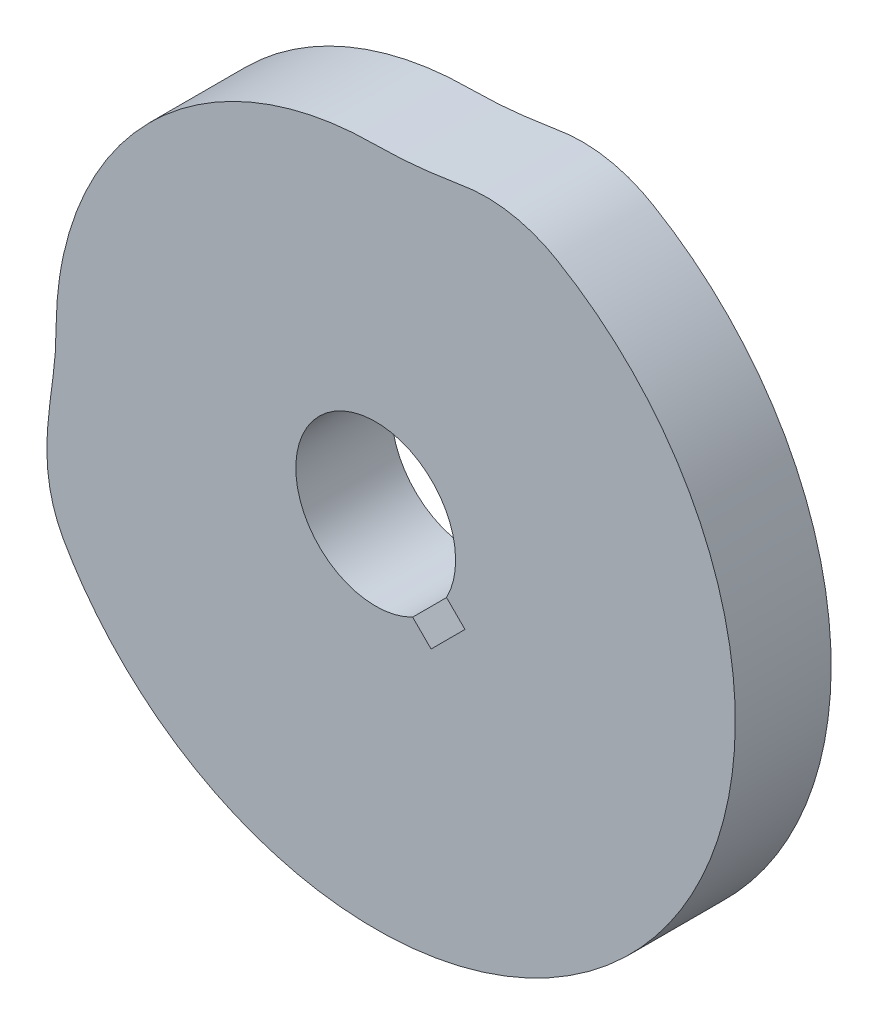
ISO-10303-21;
HEADER;
FILE_DESCRIPTION(('STEP AP214'),'2;1');
FILE_NAME('part.step','',(''),(''),'','','');
FILE_SCHEMA(('AUTOMOTIVE_DESIGN { 1 0 10303 214 1 1 1 1 }'));
ENDSEC;
DATA;
#1=APPLICATION_CONTEXT('core data for automotive mechanical design processes');
#2=APPLICATION_PROTOCOL_DEFINITION('international standard','automotive_design',2000,#1);
#3=PRODUCT_CONTEXT('',#1,'mechanical');
#4=PRODUCT('Part','Part','',(#3));
#5=PRODUCT_RELATED_PRODUCT_CATEGORY('part','',(#4));
#6=PRODUCT_DEFINITION_FORMATION('','',#4);
#7=PRODUCT_DEFINITION_CONTEXT('part definition',#1,'design');
#8=PRODUCT_DEFINITION('design','',#6,#7);
#9=PRODUCT_DEFINITION_SHAPE('','',#8);
#10=(LENGTH_UNIT() NAMED_UNIT(*) SI_UNIT(.MILLI.,.METRE.));
#11=(NAMED_UNIT(*) PLANE_ANGLE_UNIT() SI_UNIT($,.RADIAN.));
#12=(NAMED_UNIT(*) SI_UNIT($,.STERADIAN.) SOLID_ANGLE_UNIT());
#13=UNCERTAINTY_MEASURE_WITH_UNIT(LENGTH_MEASURE(1.E-05),#10,'distance_accuracy_value','');
#14=(GEOMETRIC_REPRESENTATION_CONTEXT(3) GLOBAL_UNCERTAINTY_ASSIGNED_CONTEXT((#13)) GLOBAL_UNIT_ASSIGNED_CONTEXT((#10,
#11,#12)) REPRESENTATION_CONTEXT('',''));
#15=CARTESIAN_POINT('',(0.,0.,0.));
#16=DIRECTION('',(0.,0.,1.));
#17=DIRECTION('',(1.,0.,0.));
#18=AXIS2_PLACEMENT_3D('',#15,#16,#17);
#19=CARTESIAN_POINT('',(44.1905481048647,-8.49679105260543,12.));
#20=DIRECTION('',(0.,0.,1.));
#21=DIRECTION('',(1.,0.,0.));
#22=AXIS2_PLACEMENT_3D('',#19,#20,#21);
#23=PLANE('',#22);
#24=CARTESIAN_POINT('',(-39.5852188553881,5.74547197112841,12.));
#25=CARTESIAN_POINT('',(-39.7685767256334,4.48217080823155,12.));
#26=CARTESIAN_POINT('',(-40.0143435457197,1.93801373214934,12.));
#27=CARTESIAN_POINT('',(-39.9819865880878,-1.90896293890748,12.));
#28=CARTESIAN_POINT('',(-40.271830290255,-4.44576292647884,12.));
#29=CARTESIAN_POINT('',(-40.4336717687472,-5.71200037364146,12.));
#30=CARTESIAN_POINT('',(-40.4637831177959,-5.94758965585281,12.));
#31=CARTESIAN_POINT('',(-40.5268269245617,-6.43127547951655,12.));
#32=CARTESIAN_POINT('',(-40.6238749987966,-7.16556142330347,12.));
#33=CARTESIAN_POINT('',(-40.7219773035774,-7.91773548842098,12.));
#34=CARTESIAN_POINT('',(-40.8170149053856,-8.67775183582877,12.));
#35=CARTESIAN_POINT('',(-40.9060894212526,-9.44533487879595,12.));
#36=CARTESIAN_POINT('',(-40.9862420946243,-10.2199969692243,12.));
#37=CARTESIAN_POINT('',(-41.0544925291582,-11.0010394496485,12.));
#38=CARTESIAN_POINT('',(-41.1078776081722,-11.7875573874225,12.));
#39=CARTESIAN_POINT('',(-41.1434900926315,-12.5784478890945,12.));
#40=CARTESIAN_POINT('',(-41.1585163913934,-13.3724218434235,12.));
#41=CARTESIAN_POINT('',(-41.1502730115545,-14.1680188983419,12.));
#42=CARTESIAN_POINT('',(-41.1162412213931,-14.9636254409267,12.));
#43=CARTESIAN_POINT('',(-41.0540994870558,-15.7574953192646,12.));
#44=CARTESIAN_POINT('',(-40.9617532855477,-16.5477730257197,12.));
#45=CARTESIAN_POINT('',(-40.8373618988986,-17.3325190337692,12.));
#46=CARTESIAN_POINT('',(-40.6793619319742,-18.1097370077305,12.));
#47=CARTESIAN_POINT('',(-40.4864869051933,-18.8774024374745,12.));
#48=CARTESIAN_POINT('',(-40.2577838205323,-19.6334927903333,12.));
#49=CARTESIAN_POINT('',(-39.9926219154913,-20.3760171359797,12.));
#50=CARTESIAN_POINT('',(-39.6505748766127,-21.1997004679524,12.));
#51=CARTESIAN_POINT('',(-39.3737315018102,-21.7648346534327,12.));
#52=CARTESIAN_POINT('',(-39.2005067123344,-22.0879263035953,12.));
#53=CARTESIAN_POINT('',(-39.1772580621858,-22.131288715888,12.));
#54=CARTESIAN_POINT('',(-39.1303341832609,-22.2177848313975,12.));
#55=CARTESIAN_POINT('',(-39.0591136188636,-22.3471006112728,12.));
#56=CARTESIAN_POINT('',(-39.0101063659864,-22.4324323717461,12.));
#57=CARTESIAN_POINT('',(-38.9855328313102,-22.4750579500663,12.));
#58=CARTESIAN_POINT('',(-38.9569696014689,-22.5246041063974,12.));
#59=CARTESIAN_POINT('',(-38.8996542392811,-22.6235875172582,12.));
#60=CARTESIAN_POINT('',(-38.8131143173494,-22.7717361892989,12.));
#61=CARTESIAN_POINT('',(-38.7550458425708,-22.8702796751579,12.));
#62=CARTESIAN_POINT('',(-38.7259177829049,-22.9194958904355,12.));
#63=CARTESIAN_POINT('',(-22.5633798834463,-50.2285220945727,12.));
#64=CARTESIAN_POINT('',(8.90267399609505,-54.3392394066106,12.));
#65=CARTESIAN_POINT('',(31.5383414171805,-32.0988009223609,12.));
#66=CARTESIAN_POINT('',(54.174008838266,-9.85836243811116,12.));
#67=CARTESIAN_POINT('',(50.6181363730466,21.6752119641157,12.));
#68=CARTESIAN_POINT('',(23.5980148183923,38.3162328084448,12.));
#69=CARTESIAN_POINT('',(23.4742673315902,38.3924458078253,12.));
#70=CARTESIAN_POINT('',(23.2260339372351,38.5436728285527,12.));
#71=CARTESIAN_POINT('',(22.8514638397272,38.7669184737418,12.));
#72=CARTESIAN_POINT('',(22.6003466227701,38.9133069064094,12.));
#73=CARTESIAN_POINT('',(22.474436383226,38.98589115637,12.));
#74=CARTESIAN_POINT('',(22.3579353556488,39.0530512200546,12.));
#75=CARTESIAN_POINT('',(22.1243312198801,39.1863269319425,12.));
#76=CARTESIAN_POINT('',(21.7663020037396,39.3730333468182,12.));
#77=CARTESIAN_POINT('',(21.5256700829576,39.4931920093967,12.));
#78=CARTESIAN_POINT('',(21.4046654068803,39.551850614461,12.));
#79=CARTESIAN_POINT('',(21.3053530197646,39.5999935977131,12.));
#80=CARTESIAN_POINT('',(20.9686674875785,39.7592181441145,12.));
#81=CARTESIAN_POINT('',(20.3862092485607,40.0118382103799,12.));
#82=CARTESIAN_POINT('',(19.6504699005622,40.2917107855736,12.));
#83=CARTESIAN_POINT('',(18.9017873547066,40.5379638823884,12.));
#84=CARTESIAN_POINT('',(18.1414667724305,40.750076697511,12.));
#85=CARTESIAN_POINT('',(17.3708299389774,40.9275693808468,12.));
#86=CARTESIAN_POINT('',(16.591214196298,41.0700050646133,12.));
#87=CARTESIAN_POINT('',(15.8039718036897,41.1769862847578,12.));
#88=CARTESIAN_POINT('',(15.0104665042462,41.2481699577973,12.));
#89=CARTESIAN_POINT('',(14.2120808146326,41.2832132956041,12.));
#90=CARTESIAN_POINT('',(13.4101829754708,41.2819783574431,12.));
#91=CARTESIAN_POINT('',(12.6062452003445,41.2437662853538,12.));
#92=CARTESIAN_POINT('',(11.801394044988,41.170193020185,12.));
#93=CARTESIAN_POINT('',(11.0010501075363,41.0548180247438,12.));
#94=CARTESIAN_POINT('',(10.2084823711747,40.9240323507239,12.));
#95=CARTESIAN_POINT('',(9.42477633367324,40.8044775683239,12.));
#96=CARTESIAN_POINT('',(8.6532415616415,40.6905011035197,12.));
#97=CARTESIAN_POINT('',(7.89272161330407,40.5842915831708,12.));
#98=CARTESIAN_POINT('',(7.14241504030822,40.4858137506648,12.));
#99=CARTESIAN_POINT('',(6.42383393115024,40.398300747106,12.));
#100=CARTESIAN_POINT('',(5.95502281496217,40.345803275731,12.));
#101=CARTESIAN_POINT('',(5.73327225232901,40.3220857709049,12.));
#102=CARTESIAN_POINT('',(4.46094137871511,40.1860026274082,12.));
#103=CARTESIAN_POINT('',(1.90852667018772,39.9863238783268,12.));
#104=CARTESIAN_POINT('',(-1.94284396193153,40.0144032918958,12.));
#105=CARTESIAN_POINT('',(-4.49303443171928,39.7674488252551,12.));
#106=CARTESIAN_POINT('',(-5.75928909769658,39.5832109497089,12.));
#107=CARTESIAN_POINT('',(-23.9494124249008,36.9365792982942,12.));
#108=CARTESIAN_POINT('',(-36.9449367453642,23.9365180140765,12.));
#109=CARTESIAN_POINT('',(-39.5852188553882,5.74547197112841,12.));
#110=(BOUNDED_CURVE() B_SPLINE_CURVE(3,(#24,#25,#26,#27,#28,#29,#30,#31,#32,#33,#34,#35,#36,#37,
#38,#39,#40,#41,#42,#43,#44,#45,#46,#47,#48,#49,#50,#51,#52,#53,#54,#55,#56,#57,#58,#59,#60,#61,
#62,#63,#64,#65,#66,#67,#68,#69,#70,#71,#72,#73,#74,#75,#76,#77,#78,#79,#80,#81,#82,#83,#84,#85,
#86,#87,#88,#89,#90,#91,#92,#93,#94,#95,#96,#97,#98,#99,#100,#101,#102,#103,#104,#105,#106,#107,
#108,#109),.UNSPECIFIED.,.T.,.F.) B_SPLINE_CURVE_WITH_KNOTS((4,1,1,3,1,1,1,1,1,1,1,1,1,1,1,1,1,
1,1,1,1,1,1,1,3,1,1,3,1,1,3,3,3,1,1,3,1,1,3,1,1,1,1,1,1,1,1,1,1,1,1,1,1,1,1,1,1,1,1,3,1,1,3,4),
(0.,0.0153952808874289,0.0307905617748578,0.0461858426622868,0.0490502052522881,
0.0520685184366018,0.0551184862367701,0.0581983839220622,0.0613057728546271,0.064437635544226,
0.0675905219333047,0.0707607015279046,0.0739443164742679,0.077137531062925,0.0803366734145379,
0.0835383652867671,0.0867396360823537,0.0899380172951242,0.093131613873858,0.0963191493902882,
0.0994999825390651,0.102674093428654,0.105842039362733,0.109004881330531,0.113425652621518,
0.114018968193977,0.114612283766436,0.115205599338895,0.115895244084262,0.116584888829629,
0.117274533574996,0.402110198509505,0.686945863444014,0.688698421935359,0.690450980426704,
0.692203538918048,0.693825129551741,0.695446720185434,0.697068310819127,0.698399201839161,
0.701559274357995,0.704722258816407,0.707889132442264,0.711060878065662,0.71423848547108,
0.717422952717628,0.720615287421401,0.723816507994132,0.72702764483259,0.730249741453462,
0.733483855568733,0.736731060096979,0.739992444106323,0.743233092588871,0.74641886819052,
0.749552966360096,0.752638712369684,0.755679561339569,0.758679096797581,0.761368630222895,
0.776800277259139,0.792231924295382,0.807663571331626,1.),
.UNSPECIFIED.) CURVE() GEOMETRIC_REPRESENTATION_ITEM() RATIONAL_B_SPLINE_CURVE((1.,1.,1.,1.,1.,
1.,1.,1.,1.,1.,1.,1.,1.,1.,1.,1.,1.,1.,1.,1.,1.,1.,1.,1.,1.,1.,1.,1.,1.,1.,1.,1.,1.,1.,1.,1.,1.,
1.,1.,0.744339275049357,0.744339275049357,1.,0.744339275049357,0.744339275049357,1.,1.,1.,1.,1.,
1.,1.,1.,1.,1.,1.,1.,1.,1.,1.,1.,1.,1.,1.,1.,1.,1.,1.,1.,1.,1.,1.,1.,1.,1.,1.,1.,1.,1.,1.,1.,1.,
1.,1.,0.86763024262714,0.86763024262714,1.)) REPRESENTATION_ITEM(''));
#111=CARTESIAN_POINT('',(-39.5852188553881,5.74547197112841,12.));
#112=VERTEX_POINT('',#111);
#113=EDGE_CURVE('E119',#112,#112,#110,.T.);
#114=ORIENTED_EDGE('',*,*,#113,.T.);
#115=EDGE_LOOP('',(#114));
#116=FACE_BOUND('',#115,.T.);
#117=DIRECTION('',(0.707106781186547,-0.707106781186547,0.));
#118=VECTOR('',#117,1.);
#119=CARTESIAN_POINT('',(6.92964642191069,-11.17228710903,12.));
#120=LINE('',#119,#118);
#121=CARTESIAN_POINT('',(4.62404843805638,-8.86668912517566,12.));
#122=VERTEX_POINT('',#121);
#123=CARTESIAN_POINT('',(6.92964642191069,-11.17228710903,12.));
#124=VERTEX_POINT('',#123);
#125=EDGE_CURVE('E93',#122,#124,#120,.T.);
#126=ORIENTED_EDGE('',*,*,#125,.F.);
#127=CARTESIAN_POINT('',(0.,0.,12.));
#128=DIRECTION('',(0.,0.,1.));
#129=DIRECTION('',(1.,0.,0.));
#130=AXIS2_PLACEMENT_3D('',#127,#128,#129);
#131=CIRCLE('',#130,10.);
#132=CARTESIAN_POINT('',(8.86668912517566,-4.62404843805638,12.));
#133=VERTEX_POINT('',#132);
#134=EDGE_CURVE('E84',#133,#122,#131,.T.);
#135=ORIENTED_EDGE('',*,*,#134,.F.);
#136=DIRECTION('',(-0.707106781186547,0.707106781186547,0.));
#137=VECTOR('',#136,1.);
#138=CARTESIAN_POINT('',(8.86668912517566,-4.62404843805638,12.));
#139=LINE('',#138,#137);
#140=CARTESIAN_POINT('',(11.17228710903,-6.92964642191068,12.));
#141=VERTEX_POINT('',#140);
#142=EDGE_CURVE('E109',#141,#133,#139,.T.);
#143=ORIENTED_EDGE('',*,*,#142,.F.);
#144=DIRECTION('',(0.707106781186547,0.707106781186548,0.));
#145=VECTOR('',#144,1.);
#146=CARTESIAN_POINT('',(11.17228710903,-6.92964642191069,12.));
#147=LINE('',#146,#145);
#148=EDGE_CURVE('E105',#124,#141,#147,.T.);
#149=ORIENTED_EDGE('',*,*,#148,.F.);
#150=EDGE_LOOP('',(#126,#135,#143,#149));
#151=FACE_BOUND('',#150,.T.);
#152=ADVANCED_FACE('F43',(#116,#151),#23,.T.);
#153=CARTESIAN_POINT('',(44.1905481048647,-8.49679105260543,0.));
#154=DIRECTION('',(0.,0.,1.));
#155=DIRECTION('',(1.,0.,0.));
#156=AXIS2_PLACEMENT_3D('',#153,#154,#155);
#157=PLANE('',#156);
#158=CARTESIAN_POINT('',(-39.5852188553881,5.74547197112841,0.));
#159=CARTESIAN_POINT('',(-39.7685767256334,4.48217080823155,0.));
#160=CARTESIAN_POINT('',(-40.0143435457197,1.93801373214934,0.));
#161=CARTESIAN_POINT('',(-39.9819865880878,-1.90896293890748,0.));
#162=CARTESIAN_POINT('',(-40.271830290255,-4.44576292647884,0.));
#163=CARTESIAN_POINT('',(-40.4336717687472,-5.71200037364146,0.));
#164=CARTESIAN_POINT('',(-40.4637831177959,-5.94758965585281,0.));
#165=CARTESIAN_POINT('',(-40.5268269245617,-6.43127547951655,0.));
#166=CARTESIAN_POINT('',(-40.6238749987966,-7.16556142330347,0.));
#167=CARTESIAN_POINT('',(-40.7219773035774,-7.91773548842098,0.));
#168=CARTESIAN_POINT('',(-40.8170149053856,-8.67775183582877,0.));
#169=CARTESIAN_POINT('',(-40.9060894212526,-9.44533487879595,0.));
#170=CARTESIAN_POINT('',(-40.9862420946243,-10.2199969692243,0.));
#171=CARTESIAN_POINT('',(-41.0544925291582,-11.0010394496485,0.));
#172=CARTESIAN_POINT('',(-41.1078776081722,-11.7875573874225,0.));
#173=CARTESIAN_POINT('',(-41.1434900926315,-12.5784478890945,0.));
#174=CARTESIAN_POINT('',(-41.1585163913934,-13.3724218434235,0.));
#175=CARTESIAN_POINT('',(-41.1502730115545,-14.1680188983419,0.));
#176=CARTESIAN_POINT('',(-41.1162412213931,-14.9636254409267,0.));
#177=CARTESIAN_POINT('',(-41.0540994870558,-15.7574953192646,0.));
#178=CARTESIAN_POINT('',(-40.9617532855477,-16.5477730257197,0.));
#179=CARTESIAN_POINT('',(-40.8373618988986,-17.3325190337692,0.));
#180=CARTESIAN_POINT('',(-40.6793619319742,-18.1097370077305,0.));
#181=CARTESIAN_POINT('',(-40.4864869051933,-18.8774024374745,0.));
#182=CARTESIAN_POINT('',(-40.2577838205323,-19.6334927903333,0.));
#183=CARTESIAN_POINT('',(-39.9926219154913,-20.3760171359797,0.));
#184=CARTESIAN_POINT('',(-39.6505748766127,-21.1997004679524,0.));
#185=CARTESIAN_POINT('',(-39.3737315018102,-21.7648346534327,0.));
#186=CARTESIAN_POINT('',(-39.2005067123344,-22.0879263035953,0.));
#187=CARTESIAN_POINT('',(-39.1772580621858,-22.131288715888,0.));
#188=CARTESIAN_POINT('',(-39.1303341832609,-22.2177848313975,0.));
#189=CARTESIAN_POINT('',(-39.0591136188636,-22.3471006112728,0.));
#190=CARTESIAN_POINT('',(-39.0101063659864,-22.4324323717461,0.));
#191=CARTESIAN_POINT('',(-38.9855328313102,-22.4750579500663,0.));
#192=CARTESIAN_POINT('',(-38.9569696014689,-22.5246041063974,0.));
#193=CARTESIAN_POINT('',(-38.8996542392811,-22.6235875172582,0.));
#194=CARTESIAN_POINT('',(-38.8131143173494,-22.7717361892989,0.));
#195=CARTESIAN_POINT('',(-38.7550458425708,-22.8702796751579,0.));
#196=CARTESIAN_POINT('',(-38.7259177829049,-22.9194958904355,0.));
#197=CARTESIAN_POINT('',(-22.5633798834463,-50.2285220945727,0.));
#198=CARTESIAN_POINT('',(8.90267399609505,-54.3392394066106,0.));
#199=CARTESIAN_POINT('',(31.5383414171805,-32.0988009223609,0.));
#200=CARTESIAN_POINT('',(54.174008838266,-9.85836243811116,0.));
#201=CARTESIAN_POINT('',(50.6181363730466,21.6752119641157,0.));
#202=CARTESIAN_POINT('',(23.5980148183923,38.3162328084448,0.));
#203=CARTESIAN_POINT('',(23.4742673315902,38.3924458078253,0.));
#204=CARTESIAN_POINT('',(23.2260339372351,38.5436728285527,0.));
#205=CARTESIAN_POINT('',(22.8514638397272,38.7669184737418,0.));
#206=CARTESIAN_POINT('',(22.6003466227701,38.9133069064094,0.));
#207=CARTESIAN_POINT('',(22.474436383226,38.98589115637,0.));
#208=CARTESIAN_POINT('',(22.3579353556488,39.0530512200546,0.));
#209=CARTESIAN_POINT('',(22.1243312198801,39.1863269319425,0.));
#210=CARTESIAN_POINT('',(21.7663020037396,39.3730333468182,0.));
#211=CARTESIAN_POINT('',(21.5256700829576,39.4931920093967,0.));
#212=CARTESIAN_POINT('',(21.4046654068803,39.551850614461,0.));
#213=CARTESIAN_POINT('',(21.3053530197646,39.5999935977131,0.));
#214=CARTESIAN_POINT('',(20.9686674875785,39.7592181441145,0.));
#215=CARTESIAN_POINT('',(20.3862092485607,40.0118382103799,0.));
#216=CARTESIAN_POINT('',(19.6504699005622,40.2917107855736,0.));
#217=CARTESIAN_POINT('',(18.9017873547066,40.5379638823884,0.));
#218=CARTESIAN_POINT('',(18.1414667724305,40.750076697511,0.));
#219=CARTESIAN_POINT('',(17.3708299389774,40.9275693808468,0.));
#220=CARTESIAN_POINT('',(16.591214196298,41.0700050646133,0.));
#221=CARTESIAN_POINT('',(15.8039718036897,41.1769862847578,0.));
#222=CARTESIAN_POINT('',(15.0104665042462,41.2481699577973,0.));
#223=CARTESIAN_POINT('',(14.2120808146326,41.2832132956041,0.));
#224=CARTESIAN_POINT('',(13.4101829754708,41.2819783574431,0.));
#225=CARTESIAN_POINT('',(12.6062452003445,41.2437662853538,0.));
#226=CARTESIAN_POINT('',(11.801394044988,41.170193020185,0.));
#227=CARTESIAN_POINT('',(11.0010501075363,41.0548180247438,0.));
#228=CARTESIAN_POINT('',(10.2084823711747,40.9240323507239,0.));
#229=CARTESIAN_POINT('',(9.42477633367324,40.8044775683239,0.));
#230=CARTESIAN_POINT('',(8.6532415616415,40.6905011035197,0.));
#231=CARTESIAN_POINT('',(7.89272161330407,40.5842915831708,0.));
#232=CARTESIAN_POINT('',(7.14241504030822,40.4858137506648,0.));
#233=CARTESIAN_POINT('',(6.42383393115024,40.398300747106,0.));
#234=CARTESIAN_POINT('',(5.95502281496217,40.345803275731,0.));
#235=CARTESIAN_POINT('',(5.73327225232901,40.3220857709049,0.));
#236=CARTESIAN_POINT('',(4.46094137871511,40.1860026274082,0.));
#237=CARTESIAN_POINT('',(1.90852667018772,39.9863238783268,0.));
#238=CARTESIAN_POINT('',(-1.94284396193153,40.0144032918958,0.));
#239=CARTESIAN_POINT('',(-4.49303443171928,39.7674488252551,0.));
#240=CARTESIAN_POINT('',(-5.75928909769658,39.5832109497089,0.));
#241=CARTESIAN_POINT('',(-23.9494124249008,36.9365792982942,0.));
#242=CARTESIAN_POINT('',(-36.9449367453642,23.9365180140765,0.));
#243=CARTESIAN_POINT('',(-39.5852188553882,5.74547197112841,0.));
#244=(BOUNDED_CURVE() B_SPLINE_CURVE(3,(#158,#159,#160,#161,#162,#163,#164,#165,#166,#167,#168,
#169,#170,#171,#172,#173,#174,#175,#176,#177,#178,#179,#180,#181,#182,#183,#184,#185,#186,#187,
#188,#189,#190,#191,#192,#193,#194,#195,#196,#197,#198,#199,#200,#201,#202,#203,#204,#205,#206,
#207,#208,#209,#210,#211,#212,#213,#214,#215,#216,#217,#218,#219,#220,#221,#222,#223,#224,#225,
#226,#227,#228,#229,#230,#231,#232,#233,#234,#235,#236,#237,#238,#239,#240,#241,#242,#243),
.UNSPECIFIED.,.T.,.F.) B_SPLINE_CURVE_WITH_KNOTS((4,1,1,3,1,1,1,1,1,1,1,1,1,1,1,1,1,1,1,1,1,1,1,
1,3,1,1,3,1,1,3,3,3,1,1,3,1,1,3,1,1,1,1,1,1,1,1,1,1,1,1,1,1,1,1,1,1,1,1,3,1,1,3,4),(0.,
0.0153952808874289,0.0307905617748578,0.0461858426622868,0.0490502052522881,0.0520685184366018,
0.0551184862367701,0.0581983839220622,0.0613057728546271,0.064437635544226,0.0675905219333047,
0.0707607015279046,0.0739443164742679,0.077137531062925,0.0803366734145379,0.0835383652867671,
0.0867396360823537,0.0899380172951242,0.093131613873858,0.0963191493902882,0.0994999825390651,
0.102674093428654,0.105842039362733,0.109004881330531,0.113425652621518,0.114018968193977,
0.114612283766436,0.115205599338895,0.115895244084262,0.116584888829629,0.117274533574996,
0.402110198509505,0.686945863444014,0.688698421935359,0.690450980426704,0.692203538918048,
0.693825129551741,0.695446720185434,0.697068310819127,0.698399201839161,0.701559274357995,
0.704722258816407,0.707889132442264,0.711060878065662,0.71423848547108,0.717422952717628,
0.720615287421401,0.723816507994132,0.72702764483259,0.730249741453462,0.733483855568733,
0.736731060096979,0.739992444106323,0.743233092588871,0.74641886819052,0.749552966360096,
0.752638712369684,0.755679561339569,0.758679096797581,0.761368630222895,0.776800277259139,
0.792231924295382,0.807663571331626,1.),
.UNSPECIFIED.) CURVE() GEOMETRIC_REPRESENTATION_ITEM() RATIONAL_B_SPLINE_CURVE((1.,1.,1.,1.,1.,
1.,1.,1.,1.,1.,1.,1.,1.,1.,1.,1.,1.,1.,1.,1.,1.,1.,1.,1.,1.,1.,1.,1.,1.,1.,1.,1.,1.,1.,1.,1.,1.,
1.,1.,0.744339275049357,0.744339275049357,1.,0.744339275049357,0.744339275049357,1.,1.,1.,1.,1.,
1.,1.,1.,1.,1.,1.,1.,1.,1.,1.,1.,1.,1.,1.,1.,1.,1.,1.,1.,1.,1.,1.,1.,1.,1.,1.,1.,1.,1.,1.,1.,1.,
1.,1.,0.86763024262714,0.86763024262714,1.)) REPRESENTATION_ITEM(''));
#245=CARTESIAN_POINT('',(-39.5852188553881,5.74547197112841,0.));
#246=VERTEX_POINT('',#245);
#247=EDGE_CURVE('E101',#246,#246,#244,.T.);
#248=ORIENTED_EDGE('',*,*,#247,.F.);
#249=EDGE_LOOP('',(#248));
#250=FACE_BOUND('',#249,.T.);
#251=CARTESIAN_POINT('',(0.,0.,0.));
#252=DIRECTION('',(0.,0.,1.));
#253=DIRECTION('',(1.,0.,0.));
#254=AXIS2_PLACEMENT_3D('',#251,#252,#253);
#255=CIRCLE('',#254,10.);
#256=CARTESIAN_POINT('',(4.62404843805638,-8.86668912517566,0.));
#257=VERTEX_POINT('',#256);
#258=CARTESIAN_POINT('',(8.86668912517567,-4.62404843805638,0.));
#259=VERTEX_POINT('',#258);
#260=EDGE_CURVE('E11',#257,#259,#255,.F.);
#261=ORIENTED_EDGE('',*,*,#260,.F.);
#262=DIRECTION('',(-0.707106781186548,0.707106781186548,0.));
#263=VECTOR('',#262,1.);
#264=CARTESIAN_POINT('',(24.2223492351754,-28.4649899222947,0.));
#265=LINE('',#264,#263);
#266=CARTESIAN_POINT('',(6.92964642191069,-11.17228710903,0.));
#267=VERTEX_POINT('',#266);
#268=EDGE_CURVE('E53',#267,#257,#265,.T.);
#269=ORIENTED_EDGE('',*,*,#268,.F.);
#270=DIRECTION('',(-0.707106781186547,-0.707106781186548,0.));
#271=VECTOR('',#270,1.);
#272=CARTESIAN_POINT('',(26.8978452916,8.79591176065932,0.));
#273=LINE('',#272,#271);
#274=CARTESIAN_POINT('',(11.17228710903,-6.92964642191069,0.));
#275=VERTEX_POINT('',#274);
#276=EDGE_CURVE('E140',#275,#267,#273,.T.);
#277=ORIENTED_EDGE('',*,*,#276,.F.);
#278=DIRECTION('',(0.707106781186548,-0.707106781186548,0.));
#279=VECTOR('',#278,1.);
#280=CARTESIAN_POINT('',(28.4649899222947,-24.2223492351754,0.));
#281=LINE('',#280,#279);
#282=EDGE_CURVE('E126',#259,#275,#281,.T.);
#283=ORIENTED_EDGE('',*,*,#282,.F.);
#284=EDGE_LOOP('',(#261,#269,#277,#283));
#285=FACE_BOUND('',#284,.T.);
#286=ADVANCED_FACE('F148',(#250,#285),#157,.F.);
#287=DIRECTION('',(0.,0.,-1.));
#288=VECTOR('',#287,1.);
#289=SURFACE_OF_LINEAR_EXTRUSION('',#110,#288);
#290=ORIENTED_EDGE('',*,*,#113,.F.);
#291=EDGE_LOOP('',(#290));
#292=FACE_BOUND('',#291,.T.);
#293=ORIENTED_EDGE('',*,*,#247,.T.);
#294=EDGE_LOOP('',(#293));
#295=FACE_BOUND('',#294,.T.);
#296=ADVANCED_FACE('F45',(#292,#295),#289,.F.);
#297=CARTESIAN_POINT('',(0.,0.,12.));
#298=DIRECTION('',(0.,0.,-1.));
#299=DIRECTION('',(-1.,0.,0.));
#300=AXIS2_PLACEMENT_3D('',#297,#298,#299);
#301=CYLINDRICAL_SURFACE('',#300,10.);
#302=ORIENTED_EDGE('',*,*,#260,.T.);
#303=DIRECTION('',(0.,0.,-1.));
#304=VECTOR('',#303,1.);
#305=CARTESIAN_POINT('',(8.86668912517566,-4.62404843805638,12.));
#306=LINE('',#305,#304);
#307=EDGE_CURVE('E65',#133,#259,#306,.T.);
#308=ORIENTED_EDGE('',*,*,#307,.F.);
#309=ORIENTED_EDGE('',*,*,#134,.T.);
#310=DIRECTION('',(0.,0.,-1.));
#311=VECTOR('',#310,1.);
#312=CARTESIAN_POINT('',(4.62404843805638,-8.86668912517566,12.));
#313=LINE('',#312,#311);
#314=EDGE_CURVE('E87',#122,#257,#313,.T.);
#315=ORIENTED_EDGE('',*,*,#314,.T.);
#316=EDGE_LOOP('',(#302,#308,#309,#315));
#317=FACE_BOUND('',#316,.T.);
#318=ADVANCED_FACE('F86',(#317),#301,.F.);
#319=CARTESIAN_POINT('',(6.92964642191069,-11.17228710903,12.));
#320=DIRECTION('',(0.707106781186548,0.707106781186548,0.));
#321=DIRECTION('',(-0.707106781186548,0.707106781186548,0.));
#322=AXIS2_PLACEMENT_3D('',#319,#320,#321);
#323=PLANE('',#322);
#324=ORIENTED_EDGE('',*,*,#268,.T.);
#325=ORIENTED_EDGE('',*,*,#314,.F.);
#326=ORIENTED_EDGE('',*,*,#125,.T.);
#327=DIRECTION('',(0.,0.,-1.));
#328=VECTOR('',#327,1.);
#329=CARTESIAN_POINT('',(6.92964642191069,-11.17228710903,12.));
#330=LINE('',#329,#328);
#331=EDGE_CURVE('E102',#124,#267,#330,.T.);
#332=ORIENTED_EDGE('',*,*,#331,.T.);
#333=EDGE_LOOP('',(#324,#325,#326,#332));
#334=FACE_BOUND('',#333,.T.);
#335=ADVANCED_FACE('F96',(#334),#323,.T.);
#336=CARTESIAN_POINT('',(11.17228710903,-6.92964642191069,12.));
#337=DIRECTION('',(-0.707106781186548,0.707106781186547,0.));
#338=DIRECTION('',(-0.707106781186547,-0.707106781186548,0.));
#339=AXIS2_PLACEMENT_3D('',#336,#337,#338);
#340=PLANE('',#339);
#341=ORIENTED_EDGE('',*,*,#276,.T.);
#342=ORIENTED_EDGE('',*,*,#331,.F.);
#343=ORIENTED_EDGE('',*,*,#148,.T.);
#344=DIRECTION('',(0.,0.,-1.));
#345=VECTOR('',#344,1.);
#346=CARTESIAN_POINT('',(11.17228710903,-6.92964642191069,12.));
#347=LINE('',#346,#345);
#348=EDGE_CURVE('E60',#141,#275,#347,.T.);
#349=ORIENTED_EDGE('',*,*,#348,.T.);
#350=EDGE_LOOP('',(#341,#342,#343,#349));
#351=FACE_BOUND('',#350,.T.);
#352=ADVANCED_FACE('F145',(#351),#340,.T.);
#353=CARTESIAN_POINT('',(8.86668912517566,-4.62404843805638,12.));
#354=DIRECTION('',(-0.707106781186548,-0.707106781186548,0.));
#355=DIRECTION('',(0.707106781186548,-0.707106781186548,0.));
#356=AXIS2_PLACEMENT_3D('',#353,#354,#355);
#357=PLANE('',#356);
#358=ORIENTED_EDGE('',*,*,#282,.T.);
#359=ORIENTED_EDGE('',*,*,#348,.F.);
#360=ORIENTED_EDGE('',*,*,#142,.T.);
#361=ORIENTED_EDGE('',*,*,#307,.T.);
#362=EDGE_LOOP('',(#358,#359,#360,#361));
#363=FACE_BOUND('',#362,.T.);
#364=ADVANCED_FACE('F149',(#363),#357,.T.);
#365=CLOSED_SHELL('',(#152,#286,#296,#318,#335,#352,#364));
#366=MANIFOLD_SOLID_BREP('B2',#365);
#367=ADVANCED_BREP_SHAPE_REPRESENTATION('',(#18,#366),#14);
#368=SHAPE_DEFINITION_REPRESENTATION(#9,#367);
ENDSEC;
END-ISO-10303-21;
